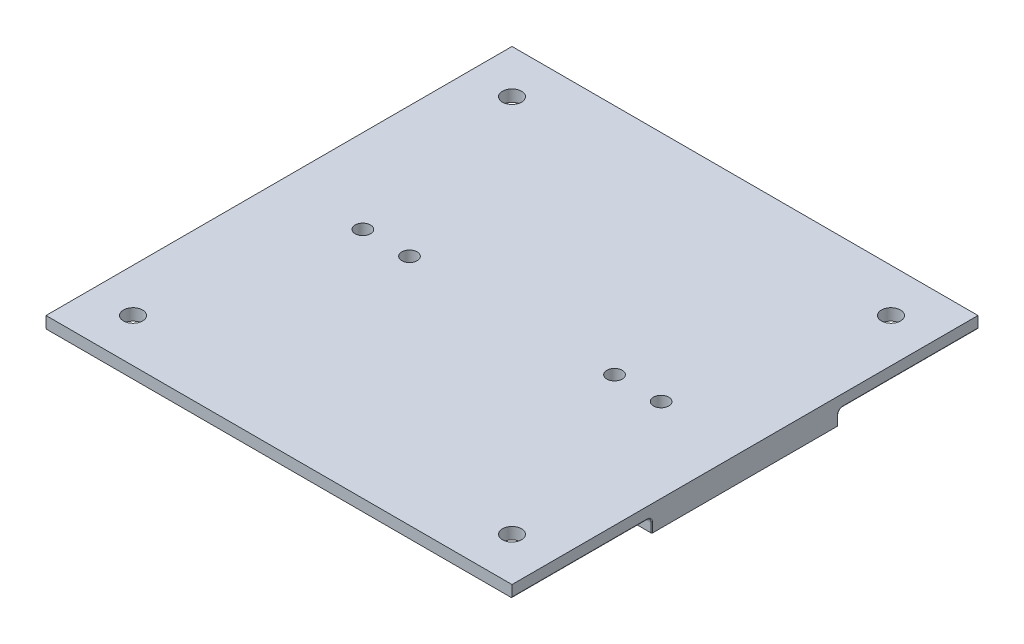
ISO-10303-21;
HEADER;
FILE_DESCRIPTION(('STEP AP214'),'2;1');
FILE_NAME('part.step','',(''),(''),'','','');
FILE_SCHEMA(('AUTOMOTIVE_DESIGN { 1 0 10303 214 1 1 1 1 }'));
ENDSEC;
DATA;
#1=APPLICATION_CONTEXT('core data for automotive mechanical design processes');
#2=APPLICATION_PROTOCOL_DEFINITION('international standard','automotive_design',2000,#1);
#3=PRODUCT_CONTEXT('',#1,'mechanical');
#4=PRODUCT('Part','Part','',(#3));
#5=PRODUCT_RELATED_PRODUCT_CATEGORY('part','',(#4));
#6=PRODUCT_DEFINITION_FORMATION('','',#4);
#7=PRODUCT_DEFINITION_CONTEXT('part definition',#1,'design');
#8=PRODUCT_DEFINITION('design','',#6,#7);
#9=PRODUCT_DEFINITION_SHAPE('','',#8);
#10=(LENGTH_UNIT() NAMED_UNIT(*) SI_UNIT(.MILLI.,.METRE.));
#11=(NAMED_UNIT(*) PLANE_ANGLE_UNIT() SI_UNIT($,.RADIAN.));
#12=(NAMED_UNIT(*) SI_UNIT($,.STERADIAN.) SOLID_ANGLE_UNIT());
#13=UNCERTAINTY_MEASURE_WITH_UNIT(LENGTH_MEASURE(1.E-05),#10,'distance_accuracy_value','');
#14=(GEOMETRIC_REPRESENTATION_CONTEXT(3) GLOBAL_UNCERTAINTY_ASSIGNED_CONTEXT((#13)) GLOBAL_UNIT_ASSIGNED_CONTEXT((#10,
#11,#12)) REPRESENTATION_CONTEXT('',''));
#15=CARTESIAN_POINT('',(0.,0.,0.));
#16=DIRECTION('',(0.,0.,1.));
#17=DIRECTION('',(1.,0.,0.));
#18=AXIS2_PLACEMENT_3D('',#15,#16,#17);
#19=CARTESIAN_POINT('',(0.,0.,0.));
#20=DIRECTION('',(0.,1.,0.));
#21=DIRECTION('',(0.,0.,1.));
#22=AXIS2_PLACEMENT_3D('',#19,#20,#21);
#23=PLANE('',#22);
#24=CARTESIAN_POINT('',(40.66,0.,-40.6599999999999));
#25=DIRECTION('',(0.,1.,0.));
#26=DIRECTION('',(0.,0.,1.));
#27=AXIS2_PLACEMENT_3D('',#24,#25,#26);
#28=CIRCLE('',#27,2.05);
#29=CARTESIAN_POINT('',(40.66,0.,-38.6099999999999));
#30=VERTEX_POINT('',#29);
#31=EDGE_CURVE('E347',#30,#30,#28,.T.);
#32=ORIENTED_EDGE('',*,*,#31,.T.);
#33=EDGE_LOOP('',(#32));
#34=FACE_BOUND('',#33,.T.);
#35=CARTESIAN_POINT('',(-40.6599999999999,0.,-40.6599999999999));
#36=DIRECTION('',(0.,1.,0.));
#37=DIRECTION('',(0.,0.,1.));
#38=AXIS2_PLACEMENT_3D('',#35,#36,#37);
#39=CIRCLE('',#38,2.05);
#40=CARTESIAN_POINT('',(-40.6599999999999,0.,-38.6099999999999));
#41=VERTEX_POINT('',#40);
#42=EDGE_CURVE('E353',#41,#41,#39,.T.);
#43=ORIENTED_EDGE('',*,*,#42,.T.);
#44=EDGE_LOOP('',(#43));
#45=FACE_BOUND('',#44,.T.);
#46=DIRECTION('',(1.,0.,0.));
#47=VECTOR('',#46,1.);
#48=CARTESIAN_POINT('',(-50.,0.,-20.9999999999999));
#49=LINE('',#48,#47);
#50=CARTESIAN_POINT('',(49.8,0.,-20.9999999999999));
#51=VERTEX_POINT('',#50);
#52=CARTESIAN_POINT('',(-49.8,0.,-20.9999999999999));
#53=VERTEX_POINT('',#52);
#54=EDGE_CURVE('E202',#51,#53,#49,.F.);
#55=ORIENTED_EDGE('',*,*,#54,.T.);
#56=DIRECTION('',(0.,0.,1.));
#57=VECTOR('',#56,1.);
#58=CARTESIAN_POINT('',(-49.8,0.,0.));
#59=LINE('',#58,#57);
#60=CARTESIAN_POINT('',(-49.8,1.66533453693773E-13,-50.));
#61=VERTEX_POINT('',#60);
#62=EDGE_CURVE('E231',#53,#61,#59,.F.);
#63=ORIENTED_EDGE('',*,*,#62,.T.);
#64=DIRECTION('',(-1.,0.,0.));
#65=VECTOR('',#64,1.);
#66=CARTESIAN_POINT('',(-50.,1.66533453693773E-13,-50.));
#67=LINE('',#66,#65);
#68=CARTESIAN_POINT('',(49.8,1.11022302462516E-13,-50.));
#69=VERTEX_POINT('',#68);
#70=EDGE_CURVE('E359',#69,#61,#67,.T.);
#71=ORIENTED_EDGE('',*,*,#70,.F.);
#72=DIRECTION('',(0.,0.,-1.));
#73=VECTOR('',#72,1.);
#74=CARTESIAN_POINT('',(49.8,0.,0.));
#75=LINE('',#74,#73);
#76=EDGE_CURVE('E229',#69,#51,#75,.F.);
#77=ORIENTED_EDGE('',*,*,#76,.T.);
#78=EDGE_LOOP('',(#55,#63,#71,#77));
#79=FACE_BOUND('',#78,.T.);
#80=ADVANCED_FACE('F45',(#34,#45,#79),#23,.F.);
#81=CARTESIAN_POINT('',(-40.66,1.11022302462516E-13,40.6599999999999));
#82=DIRECTION('',(0.,1.,0.));
#83=DIRECTION('',(0.,0.,1.));
#84=AXIS2_PLACEMENT_3D('',#81,#82,#83);
#85=CIRCLE('',#84,2.05);
#86=CARTESIAN_POINT('',(-40.66,1.11022302462516E-13,42.7099999999999));
#87=VERTEX_POINT('',#86);
#88=EDGE_CURVE('E337',#87,#87,#85,.T.);
#89=ORIENTED_EDGE('',*,*,#88,.T.);
#90=EDGE_LOOP('',(#89));
#91=FACE_BOUND('',#90,.T.);
#92=CARTESIAN_POINT('',(40.6600000000001,1.66533453693773E-13,40.6599999999999));
#93=DIRECTION('',(0.,1.,0.));
#94=DIRECTION('',(0.,0.,1.));
#95=AXIS2_PLACEMENT_3D('',#92,#93,#94);
#96=CIRCLE('',#95,2.04999999999999);
#97=CARTESIAN_POINT('',(40.6600000000001,1.66533453693773E-13,42.7099999999999));
#98=VERTEX_POINT('',#97);
#99=EDGE_CURVE('E341',#98,#98,#96,.T.);
#100=ORIENTED_EDGE('',*,*,#99,.T.);
#101=EDGE_LOOP('',(#100));
#102=FACE_BOUND('',#101,.T.);
#103=DIRECTION('',(1.,0.,0.));
#104=VECTOR('',#103,1.);
#105=CARTESIAN_POINT('',(-49.9999999999999,0.,50.0000000000003));
#106=LINE('',#105,#104);
#107=CARTESIAN_POINT('',(-49.8,0.,50.0000000000003));
#108=VERTEX_POINT('',#107);
#109=CARTESIAN_POINT('',(49.8,0.,50.0000000000003));
#110=VERTEX_POINT('',#109);
#111=EDGE_CURVE('E193',#108,#110,#106,.T.);
#112=ORIENTED_EDGE('',*,*,#111,.F.);
#113=DIRECTION('',(0.,0.,1.));
#114=VECTOR('',#113,1.);
#115=CARTESIAN_POINT('',(-49.8,0.,0.));
#116=LINE('',#115,#114);
#117=CARTESIAN_POINT('',(-49.7999999999997,1.66533453693773E-13,20.9999999999999));
#118=VERTEX_POINT('',#117);
#119=EDGE_CURVE('E247',#108,#118,#116,.F.);
#120=ORIENTED_EDGE('',*,*,#119,.T.);
#121=DIRECTION('',(-1.,0.,0.));
#122=VECTOR('',#121,1.);
#123=CARTESIAN_POINT('',(50.0000000000003,1.11022302462516E-13,20.9999999999999));
#124=LINE('',#123,#122);
#125=CARTESIAN_POINT('',(49.8000000000002,1.11022302462516E-13,20.9999999999999));
#126=VERTEX_POINT('',#125);
#127=EDGE_CURVE('E212',#118,#126,#124,.F.);
#128=ORIENTED_EDGE('',*,*,#127,.T.);
#129=DIRECTION('',(0.,0.,-1.));
#130=VECTOR('',#129,1.);
#131=CARTESIAN_POINT('',(49.8,0.,0.));
#132=LINE('',#131,#130);
#133=EDGE_CURVE('E245',#126,#110,#132,.F.);
#134=ORIENTED_EDGE('',*,*,#133,.T.);
#135=EDGE_LOOP('',(#112,#120,#128,#134));
#136=FACE_BOUND('',#135,.T.);
#137=ADVANCED_FACE('F383',(#91,#102,#136),#23,.F.);
#138=CARTESIAN_POINT('',(-2.22044604925031E-13,2.49999999999995,0.));
#139=DIRECTION('',(0.,1.,0.));
#140=DIRECTION('',(0.,0.,1.));
#141=AXIS2_PLACEMENT_3D('',#138,#139,#140);
#142=PLANE('',#141);
#143=CARTESIAN_POINT('',(31.9999999999998,2.49999999999995,0.));
#144=DIRECTION('',(0.,-1.,0.));
#145=DIRECTION('',(0.,0.,-1.));
#146=AXIS2_PLACEMENT_3D('',#143,#144,#145);
#147=CIRCLE('',#146,1.65);
#148=CARTESIAN_POINT('',(31.9999999999998,2.49999999999995,-1.65));
#149=VERTEX_POINT('',#148);
#150=EDGE_CURVE('E295',#149,#149,#147,.T.);
#151=ORIENTED_EDGE('',*,*,#150,.T.);
#152=EDGE_LOOP('',(#151));
#153=FACE_BOUND('',#152,.T.);
#154=CARTESIAN_POINT('',(21.9999999999998,2.49999999999995,0.));
#155=DIRECTION('',(0.,-1.,0.));
#156=DIRECTION('',(0.,0.,-1.));
#157=AXIS2_PLACEMENT_3D('',#154,#155,#156);
#158=CIRCLE('',#157,1.65);
#159=CARTESIAN_POINT('',(21.9999999999998,2.49999999999995,-1.64999999999997));
#160=VERTEX_POINT('',#159);
#161=EDGE_CURVE('E313',#160,#160,#158,.T.);
#162=ORIENTED_EDGE('',*,*,#161,.T.);
#163=EDGE_LOOP('',(#162));
#164=FACE_BOUND('',#163,.T.);
#165=CARTESIAN_POINT('',(-22.0000000000002,2.5,0.));
#166=DIRECTION('',(0.,-1.,0.));
#167=DIRECTION('',(0.,0.,-1.));
#168=AXIS2_PLACEMENT_3D('',#165,#166,#167);
#169=CIRCLE('',#168,1.65);
#170=CARTESIAN_POINT('',(-22.0000000000002,2.5,-1.65));
#171=VERTEX_POINT('',#170);
#172=EDGE_CURVE('E319',#171,#171,#169,.T.);
#173=ORIENTED_EDGE('',*,*,#172,.T.);
#174=EDGE_LOOP('',(#173));
#175=FACE_BOUND('',#174,.T.);
#176=CARTESIAN_POINT('',(-32.0000000000002,2.49999999999995,0.));
#177=DIRECTION('',(0.,-1.,0.));
#178=DIRECTION('',(0.,0.,-1.));
#179=AXIS2_PLACEMENT_3D('',#176,#177,#178);
#180=CIRCLE('',#179,1.65);
#181=CARTESIAN_POINT('',(-32.0000000000002,2.49999999999995,-1.65));
#182=VERTEX_POINT('',#181);
#183=EDGE_CURVE('E325',#182,#182,#180,.T.);
#184=ORIENTED_EDGE('',*,*,#183,.T.);
#185=EDGE_LOOP('',(#184));
#186=FACE_BOUND('',#185,.T.);
#187=CARTESIAN_POINT('',(40.6600000000002,2.50000000000011,40.6599999999999));
#188=DIRECTION('',(0.,1.,0.));
#189=DIRECTION('',(0.,0.,1.));
#190=AXIS2_PLACEMENT_3D('',#187,#188,#189);
#191=CIRCLE('',#190,2.04999999999999);
#192=CARTESIAN_POINT('',(40.6600000000002,2.50000000000011,42.7099999999999));
#193=VERTEX_POINT('',#192);
#194=EDGE_CURVE('E344',#193,#193,#191,.T.);
#195=ORIENTED_EDGE('',*,*,#194,.F.);
#196=EDGE_LOOP('',(#195));
#197=FACE_BOUND('',#196,.T.);
#198=CARTESIAN_POINT('',(-40.6599999999998,2.49999999999995,-40.6599999999999));
#199=DIRECTION('',(0.,1.,0.));
#200=DIRECTION('',(0.,0.,1.));
#201=AXIS2_PLACEMENT_3D('',#198,#199,#200);
#202=CIRCLE('',#201,2.05);
#203=CARTESIAN_POINT('',(-40.6599999999998,2.49999999999995,-38.6099999999999));
#204=VERTEX_POINT('',#203);
#205=EDGE_CURVE('E356',#204,#204,#202,.T.);
#206=ORIENTED_EDGE('',*,*,#205,.F.);
#207=EDGE_LOOP('',(#206));
#208=FACE_BOUND('',#207,.T.);
#209=DIRECTION('',(0.,0.,-1.));
#210=VECTOR('',#209,1.);
#211=CARTESIAN_POINT('',(49.9999999999998,2.50000000000006,-50.));
#212=LINE('',#211,#210);
#213=CARTESIAN_POINT('',(49.9999999999998,2.49999999999995,50.0000000000003));
#214=VERTEX_POINT('',#213);
#215=CARTESIAN_POINT('',(49.9999999999998,2.50000000000006,-50.));
#216=VERTEX_POINT('',#215);
#217=EDGE_CURVE('E183',#214,#216,#212,.T.);
#218=ORIENTED_EDGE('',*,*,#217,.T.);
#219=DIRECTION('',(-1.,0.,0.));
#220=VECTOR('',#219,1.);
#221=CARTESIAN_POINT('',(-50.0000000000003,2.50000000000011,-50.));
#222=LINE('',#221,#220);
#223=CARTESIAN_POINT('',(-50.0000000000003,2.50000000000011,-50.));
#224=VERTEX_POINT('',#223);
#225=EDGE_CURVE('E172',#216,#224,#222,.T.);
#226=ORIENTED_EDGE('',*,*,#225,.T.);
#227=DIRECTION('',(0.,0.,1.));
#228=VECTOR('',#227,1.);
#229=CARTESIAN_POINT('',(-50.0000000000003,2.50000000000011,-50.));
#230=LINE('',#229,#228);
#231=CARTESIAN_POINT('',(-50.0000000000002,2.5,50.0000000000003));
#232=VERTEX_POINT('',#231);
#233=EDGE_CURVE('E182',#224,#232,#230,.T.);
#234=ORIENTED_EDGE('',*,*,#233,.T.);
#235=DIRECTION('',(1.,0.,0.));
#236=VECTOR('',#235,1.);
#237=CARTESIAN_POINT('',(-50.0000000000002,2.5,50.0000000000003));
#238=LINE('',#237,#236);
#239=EDGE_CURVE('E189',#232,#214,#238,.T.);
#240=ORIENTED_EDGE('',*,*,#239,.T.);
#241=EDGE_LOOP('',(#218,#226,#234,#240));
#242=FACE_BOUND('',#241,.T.);
#243=CARTESIAN_POINT('',(40.6600000000002,2.5,-40.6599999999999));
#244=DIRECTION('',(0.,1.,0.));
#245=DIRECTION('',(0.,0.,1.));
#246=AXIS2_PLACEMENT_3D('',#243,#244,#245);
#247=CIRCLE('',#246,2.05);
#248=CARTESIAN_POINT('',(40.6600000000002,2.5,-38.6099999999999));
#249=VERTEX_POINT('',#248);
#250=EDGE_CURVE('E350',#249,#249,#247,.T.);
#251=ORIENTED_EDGE('',*,*,#250,.F.);
#252=EDGE_LOOP('',(#251));
#253=FACE_BOUND('',#252,.T.);
#254=CARTESIAN_POINT('',(-40.6599999999998,2.50000000000006,40.6599999999999));
#255=DIRECTION('',(0.,1.,0.));
#256=DIRECTION('',(0.,0.,1.));
#257=AXIS2_PLACEMENT_3D('',#254,#255,#256);
#258=CIRCLE('',#257,2.05);
#259=CARTESIAN_POINT('',(-40.6599999999998,2.50000000000006,42.7099999999999));
#260=VERTEX_POINT('',#259);
#261=EDGE_CURVE('E338',#260,#260,#258,.T.);
#262=ORIENTED_EDGE('',*,*,#261,.F.);
#263=EDGE_LOOP('',(#262));
#264=FACE_BOUND('',#263,.T.);
#265=ADVANCED_FACE('F186',(#153,#164,#175,#186,#197,#208,#242,#253,#264),#142,.T.);
#266=CARTESIAN_POINT('',(49.9999999999998,2.50000000000006,-50.));
#267=DIRECTION('',(-1.,0.,0.));
#268=DIRECTION('',(0.,0.,1.));
#269=AXIS2_PLACEMENT_3D('',#266,#267,#268);
#270=PLANE('',#269);
#271=CARTESIAN_POINT('',(50.,-1.,-20.9999999999999));
#272=DIRECTION('',(-1.,0.,0.));
#273=DIRECTION('',(0.,0.,1.));
#274=AXIS2_PLACEMENT_3D('',#271,#272,#273);
#275=CIRCLE('',#274,1.2);
#276=CARTESIAN_POINT('',(50.,-1.,-19.8));
#277=VERTEX_POINT('',#276);
#278=CARTESIAN_POINT('',(50.,0.199999999999978,-20.9999999999999));
#279=VERTEX_POINT('',#278);
#280=EDGE_CURVE('E262',#277,#279,#275,.T.);
#281=ORIENTED_EDGE('',*,*,#280,.T.);
#282=DIRECTION('',(0.,0.,-1.));
#283=VECTOR('',#282,1.);
#284=CARTESIAN_POINT('',(50.,0.200000000000089,-50.));
#285=LINE('',#284,#283);
#286=CARTESIAN_POINT('',(50.,0.200000000000089,-50.));
#287=VERTEX_POINT('',#286);
#288=EDGE_CURVE('E198',#279,#287,#285,.T.);
#289=ORIENTED_EDGE('',*,*,#288,.T.);
#290=DIRECTION('',(0.,-1.,0.));
#291=VECTOR('',#290,1.);
#292=CARTESIAN_POINT('',(49.9999999999998,2.50000000000006,-50.));
#293=LINE('',#292,#291);
#294=EDGE_CURVE('E177',#216,#287,#293,.T.);
#295=ORIENTED_EDGE('',*,*,#294,.F.);
#296=ORIENTED_EDGE('',*,*,#217,.F.);
#297=DIRECTION('',(0.,-1.,0.));
#298=VECTOR('',#297,1.);
#299=CARTESIAN_POINT('',(49.9999999999998,2.49999999999995,50.0000000000003));
#300=LINE('',#299,#298);
#301=CARTESIAN_POINT('',(50.,0.199999999999978,50.0000000000003));
#302=VERTEX_POINT('',#301);
#303=EDGE_CURVE('E364',#214,#302,#300,.T.);
#304=ORIENTED_EDGE('',*,*,#303,.T.);
#305=DIRECTION('',(0.,0.,-1.));
#306=VECTOR('',#305,1.);
#307=CARTESIAN_POINT('',(50.,0.200000000000089,-50.));
#308=LINE('',#307,#306);
#309=CARTESIAN_POINT('',(50.0000000000003,0.200000000000089,20.9999999999999));
#310=VERTEX_POINT('',#309);
#311=EDGE_CURVE('E257',#302,#310,#308,.T.);
#312=ORIENTED_EDGE('',*,*,#311,.T.);
#313=CARTESIAN_POINT('',(50.,-0.99999999999989,20.9999999999999));
#314=DIRECTION('',(-1.,0.,0.));
#315=DIRECTION('',(0.,0.,1.));
#316=AXIS2_PLACEMENT_3D('',#313,#314,#315);
#317=CIRCLE('',#316,1.2);
#318=CARTESIAN_POINT('',(50.0000000000003,-1.,19.8));
#319=VERTEX_POINT('',#318);
#320=EDGE_CURVE('E255',#310,#319,#317,.T.);
#321=ORIENTED_EDGE('',*,*,#320,.T.);
#322=DIRECTION('',(0.,1.,0.));
#323=VECTOR('',#322,1.);
#324=CARTESIAN_POINT('',(50.,2.49999999999995,19.8));
#325=LINE('',#324,#323);
#326=CARTESIAN_POINT('',(49.9999999999998,-3.,19.8));
#327=VERTEX_POINT('',#326);
#328=EDGE_CURVE('E253',#319,#327,#325,.F.);
#329=ORIENTED_EDGE('',*,*,#328,.T.);
#330=DIRECTION('',(0.,0.,1.));
#331=VECTOR('',#330,1.);
#332=CARTESIAN_POINT('',(49.9999999999998,-3.,20.));
#333=LINE('',#332,#331);
#334=CARTESIAN_POINT('',(49.9999999999999,-3.,-19.8));
#335=VERTEX_POINT('',#334);
#336=EDGE_CURVE('E283',#335,#327,#333,.T.);
#337=ORIENTED_EDGE('',*,*,#336,.F.);
#338=DIRECTION('',(0.,1.,0.));
#339=VECTOR('',#338,1.);
#340=CARTESIAN_POINT('',(49.9999999999998,2.49999999999995,-19.8));
#341=LINE('',#340,#339);
#342=EDGE_CURVE('E260',#335,#277,#341,.T.);
#343=ORIENTED_EDGE('',*,*,#342,.T.);
#344=EDGE_LOOP('',(#281,#289,#295,#296,#304,#312,#321,#329,#337,#343));
#345=FACE_BOUND('',#344,.T.);
#346=ADVANCED_FACE('F196',(#345),#270,.F.);
#347=CARTESIAN_POINT('',(-50.0000000000003,2.50000000000011,-50.));
#348=DIRECTION('',(0.,0.,1.));
#349=DIRECTION('',(1.,0.,0.));
#350=AXIS2_PLACEMENT_3D('',#347,#348,#349);
#351=PLANE('',#350);
#352=ORIENTED_EDGE('',*,*,#70,.T.);
#353=CARTESIAN_POINT('',(-49.8,0.200000000000145,-50.));
#354=DIRECTION('',(0.,0.,1.));
#355=DIRECTION('',(1.,0.,0.));
#356=AXIS2_PLACEMENT_3D('',#353,#354,#355);
#357=CIRCLE('',#356,0.2);
#358=CARTESIAN_POINT('',(-50.,0.200000000000145,-50.));
#359=VERTEX_POINT('',#358);
#360=EDGE_CURVE('E235',#61,#359,#357,.F.);
#361=ORIENTED_EDGE('',*,*,#360,.T.);
#362=DIRECTION('',(0.,-1.,0.));
#363=VECTOR('',#362,1.);
#364=CARTESIAN_POINT('',(-50.0000000000003,2.50000000000011,-50.));
#365=LINE('',#364,#363);
#366=EDGE_CURVE('E179',#224,#359,#365,.T.);
#367=ORIENTED_EDGE('',*,*,#366,.F.);
#368=ORIENTED_EDGE('',*,*,#225,.F.);
#369=ORIENTED_EDGE('',*,*,#294,.T.);
#370=CARTESIAN_POINT('',(49.8,0.200000000000089,-50.));
#371=DIRECTION('',(0.,0.,1.));
#372=DIRECTION('',(1.,0.,0.));
#373=AXIS2_PLACEMENT_3D('',#370,#371,#372);
#374=CIRCLE('',#373,0.2);
#375=EDGE_CURVE('E233',#287,#69,#374,.F.);
#376=ORIENTED_EDGE('',*,*,#375,.T.);
#377=EDGE_LOOP('',(#352,#361,#367,#368,#369,#376));
#378=FACE_BOUND('',#377,.T.);
#379=ADVANCED_FACE('F175',(#378),#351,.F.);
#380=CARTESIAN_POINT('',(-50.0000000000003,2.50000000000011,-50.));
#381=DIRECTION('',(1.,0.,0.));
#382=DIRECTION('',(0.,0.,-1.));
#383=AXIS2_PLACEMENT_3D('',#380,#381,#382);
#384=PLANE('',#383);
#385=ORIENTED_EDGE('',*,*,#366,.T.);
#386=DIRECTION('',(0.,0.,1.));
#387=VECTOR('',#386,1.);
#388=CARTESIAN_POINT('',(-50.,0.200000000000145,-50.));
#389=LINE('',#388,#387);
#390=CARTESIAN_POINT('',(-50.,0.200000000000033,-20.9999999999999));
#391=VERTEX_POINT('',#390);
#392=EDGE_CURVE('E226',#359,#391,#389,.T.);
#393=ORIENTED_EDGE('',*,*,#392,.T.);
#394=CARTESIAN_POINT('',(-50.,-0.999999999999945,-20.9999999999999));
#395=DIRECTION('',(1.,0.,0.));
#396=DIRECTION('',(0.,0.,-1.));
#397=AXIS2_PLACEMENT_3D('',#394,#395,#396);
#398=CIRCLE('',#397,1.2);
#399=CARTESIAN_POINT('',(-50.,-0.999999999999945,-19.8));
#400=VERTEX_POINT('',#399);
#401=EDGE_CURVE('E224',#391,#400,#398,.T.);
#402=ORIENTED_EDGE('',*,*,#401,.T.);
#403=DIRECTION('',(0.,1.,0.));
#404=VECTOR('',#403,1.);
#405=CARTESIAN_POINT('',(-50.0000000000003,2.5,-19.8));
#406=LINE('',#405,#404);
#407=CARTESIAN_POINT('',(-50.,-2.99999999999995,-19.8));
#408=VERTEX_POINT('',#407);
#409=EDGE_CURVE('E222',#400,#408,#406,.F.);
#410=ORIENTED_EDGE('',*,*,#409,.T.);
#411=DIRECTION('',(0.,0.,-1.));
#412=VECTOR('',#411,1.);
#413=CARTESIAN_POINT('',(-50.,-2.99999999999995,20.));
#414=LINE('',#413,#412);
#415=CARTESIAN_POINT('',(-50.,-2.99999999999995,19.8000000000001));
#416=VERTEX_POINT('',#415);
#417=EDGE_CURVE('E331',#416,#408,#414,.T.);
#418=ORIENTED_EDGE('',*,*,#417,.F.);
#419=DIRECTION('',(0.,1.,0.));
#420=VECTOR('',#419,1.);
#421=CARTESIAN_POINT('',(-50.,2.5,19.8000000000001));
#422=LINE('',#421,#420);
#423=CARTESIAN_POINT('',(-49.9999999999998,-0.999999999999945,19.8000000000001));
#424=VERTEX_POINT('',#423);
#425=EDGE_CURVE('E215',#416,#424,#422,.T.);
#426=ORIENTED_EDGE('',*,*,#425,.T.);
#427=CARTESIAN_POINT('',(-50.,-0.999999999999834,20.9999999999999));
#428=DIRECTION('',(1.,0.,0.));
#429=DIRECTION('',(0.,0.,-1.));
#430=AXIS2_PLACEMENT_3D('',#427,#428,#429);
#431=CIRCLE('',#430,1.2);
#432=CARTESIAN_POINT('',(-49.9999999999998,0.200000000000145,20.9999999999999));
#433=VERTEX_POINT('',#432);
#434=EDGE_CURVE('E217',#424,#433,#431,.T.);
#435=ORIENTED_EDGE('',*,*,#434,.T.);
#436=DIRECTION('',(0.,0.,1.));
#437=VECTOR('',#436,1.);
#438=CARTESIAN_POINT('',(-50.,0.200000000000145,-50.));
#439=LINE('',#438,#437);
#440=CARTESIAN_POINT('',(-49.9999999999999,0.200000000000033,50.0000000000003));
#441=VERTEX_POINT('',#440);
#442=EDGE_CURVE('E219',#433,#441,#439,.T.);
#443=ORIENTED_EDGE('',*,*,#442,.T.);
#444=DIRECTION('',(0.,-1.,0.));
#445=VECTOR('',#444,1.);
#446=CARTESIAN_POINT('',(-50.0000000000002,2.5,50.0000000000003));
#447=LINE('',#446,#445);
#448=EDGE_CURVE('E204',#232,#441,#447,.T.);
#449=ORIENTED_EDGE('',*,*,#448,.F.);
#450=ORIENTED_EDGE('',*,*,#233,.F.);
#451=EDGE_LOOP('',(#385,#393,#402,#410,#418,#426,#435,#443,#449,#450));
#452=FACE_BOUND('',#451,.T.);
#453=ADVANCED_FACE('F374',(#452),#384,.F.);
#454=CARTESIAN_POINT('',(-50.0000000000002,2.5,50.0000000000003));
#455=DIRECTION('',(0.,0.,-1.));
#456=DIRECTION('',(-1.,0.,0.));
#457=AXIS2_PLACEMENT_3D('',#454,#455,#456);
#458=PLANE('',#457);
#459=ORIENTED_EDGE('',*,*,#448,.T.);
#460=CARTESIAN_POINT('',(-49.8,0.200000000000033,50.0000000000003));
#461=DIRECTION('',(0.,0.,-1.));
#462=DIRECTION('',(-1.,0.,0.));
#463=AXIS2_PLACEMENT_3D('',#460,#461,#462);
#464=CIRCLE('',#463,0.2);
#465=EDGE_CURVE('E243',#441,#108,#464,.F.);
#466=ORIENTED_EDGE('',*,*,#465,.T.);
#467=ORIENTED_EDGE('',*,*,#111,.T.);
#468=CARTESIAN_POINT('',(49.8,0.199999999999978,50.0000000000003));
#469=DIRECTION('',(0.,0.,-1.));
#470=DIRECTION('',(-1.,0.,0.));
#471=AXIS2_PLACEMENT_3D('',#468,#469,#470);
#472=CIRCLE('',#471,0.2);
#473=EDGE_CURVE('E241',#110,#302,#472,.F.);
#474=ORIENTED_EDGE('',*,*,#473,.T.);
#475=ORIENTED_EDGE('',*,*,#303,.F.);
#476=ORIENTED_EDGE('',*,*,#239,.F.);
#477=EDGE_LOOP('',(#459,#466,#467,#474,#475,#476));
#478=FACE_BOUND('',#477,.T.);
#479=ADVANCED_FACE('F371',(#478),#458,.F.);
#480=CARTESIAN_POINT('',(-40.6599999999998,2.49999999999995,-40.6599999999999));
#481=DIRECTION('',(0.,-1.,0.));
#482=DIRECTION('',(0.,0.,-1.));
#483=AXIS2_PLACEMENT_3D('',#480,#481,#482);
#484=CYLINDRICAL_SURFACE('',#483,2.05);
#485=ORIENTED_EDGE('',*,*,#205,.T.);
#486=EDGE_LOOP('',(#485));
#487=FACE_BOUND('',#486,.T.);
#488=ORIENTED_EDGE('',*,*,#42,.F.);
#489=EDGE_LOOP('',(#488));
#490=FACE_BOUND('',#489,.T.);
#491=ADVANCED_FACE('F472',(#487,#490),#484,.F.);
#492=CARTESIAN_POINT('',(40.6600000000002,2.5,-40.6599999999999));
#493=DIRECTION('',(0.,-1.,0.));
#494=DIRECTION('',(0.,0.,-1.));
#495=AXIS2_PLACEMENT_3D('',#492,#493,#494);
#496=CYLINDRICAL_SURFACE('',#495,2.05);
#497=ORIENTED_EDGE('',*,*,#250,.T.);
#498=EDGE_LOOP('',(#497));
#499=FACE_BOUND('',#498,.T.);
#500=ORIENTED_EDGE('',*,*,#31,.F.);
#501=EDGE_LOOP('',(#500));
#502=FACE_BOUND('',#501,.T.);
#503=ADVANCED_FACE('F568',(#499,#502),#496,.F.);
#504=CARTESIAN_POINT('',(40.6600000000002,2.50000000000011,40.6599999999999));
#505=DIRECTION('',(0.,-1.,0.));
#506=DIRECTION('',(0.,0.,-1.));
#507=AXIS2_PLACEMENT_3D('',#504,#505,#506);
#508=CYLINDRICAL_SURFACE('',#507,2.04999999999999);
#509=ORIENTED_EDGE('',*,*,#194,.T.);
#510=EDGE_LOOP('',(#509));
#511=FACE_BOUND('',#510,.T.);
#512=ORIENTED_EDGE('',*,*,#99,.F.);
#513=EDGE_LOOP('',(#512));
#514=FACE_BOUND('',#513,.T.);
#515=ADVANCED_FACE('F564',(#511,#514),#508,.F.);
#516=CARTESIAN_POINT('',(-40.6599999999998,2.50000000000006,40.6599999999999));
#517=DIRECTION('',(0.,-1.,0.));
#518=DIRECTION('',(0.,0.,-1.));
#519=AXIS2_PLACEMENT_3D('',#516,#517,#518);
#520=CYLINDRICAL_SURFACE('',#519,2.05);
#521=ORIENTED_EDGE('',*,*,#261,.T.);
#522=EDGE_LOOP('',(#521));
#523=FACE_BOUND('',#522,.T.);
#524=ORIENTED_EDGE('',*,*,#88,.F.);
#525=EDGE_LOOP('',(#524));
#526=FACE_BOUND('',#525,.T.);
#527=ADVANCED_FACE('F561',(#523,#526),#520,.F.);
#528=CARTESIAN_POINT('',(-50.,-2.99999999999995,20.));
#529=DIRECTION('',(0.,0.,-1.));
#530=DIRECTION('',(-1.,0.,0.));
#531=AXIS2_PLACEMENT_3D('',#528,#529,#530);
#532=PLANE('',#531);
#533=DIRECTION('',(-1.,0.,0.));
#534=VECTOR('',#533,1.);
#535=CARTESIAN_POINT('',(-49.9999999999998,-0.999999999999945,20.));
#536=LINE('',#535,#534);
#537=CARTESIAN_POINT('',(49.8000000000002,-1.,20.));
#538=VERTEX_POINT('',#537);
#539=CARTESIAN_POINT('',(-49.7999999999997,-0.999999999999945,20.));
#540=VERTEX_POINT('',#539);
#541=EDGE_CURVE('E210',#538,#540,#536,.T.);
#542=ORIENTED_EDGE('',*,*,#541,.T.);
#543=DIRECTION('',(0.,1.,0.));
#544=VECTOR('',#543,1.);
#545=CARTESIAN_POINT('',(-49.8,-2.99999999999995,20.));
#546=LINE('',#545,#544);
#547=CARTESIAN_POINT('',(-49.8,-2.99999999999995,20.));
#548=VERTEX_POINT('',#547);
#549=EDGE_CURVE('E11',#540,#548,#546,.F.);
#550=ORIENTED_EDGE('',*,*,#549,.T.);
#551=DIRECTION('',(-1.,0.,0.));
#552=VECTOR('',#551,1.);
#553=CARTESIAN_POINT('',(-50.,-2.99999999999995,20.));
#554=LINE('',#553,#552);
#555=CARTESIAN_POINT('',(49.8,-3.,20.));
#556=VERTEX_POINT('',#555);
#557=EDGE_CURVE('E329',#556,#548,#554,.T.);
#558=ORIENTED_EDGE('',*,*,#557,.F.);
#559=DIRECTION('',(0.,1.,0.));
#560=VECTOR('',#559,1.);
#561=CARTESIAN_POINT('',(49.8,-3.,20.));
#562=LINE('',#561,#560);
#563=EDGE_CURVE('E54',#556,#538,#562,.T.);
#564=ORIENTED_EDGE('',*,*,#563,.T.);
#565=EDGE_LOOP('',(#542,#550,#558,#564));
#566=FACE_BOUND('',#565,.T.);
#567=ADVANCED_FACE('F558',(#566),#532,.F.);
#568=CARTESIAN_POINT('',(-50.,-2.99999999999995,-20.));
#569=DIRECTION('',(0.,0.,1.));
#570=DIRECTION('',(1.,0.,0.));
#571=AXIS2_PLACEMENT_3D('',#568,#569,#570);
#572=PLANE('',#571);
#573=DIRECTION('',(1.,0.,0.));
#574=VECTOR('',#573,1.);
#575=CARTESIAN_POINT('',(-50.,-2.99999999999995,-20.));
#576=LINE('',#575,#574);
#577=CARTESIAN_POINT('',(-49.8,-2.99999999999995,-20.));
#578=VERTEX_POINT('',#577);
#579=CARTESIAN_POINT('',(49.8,-3.,-20.));
#580=VERTEX_POINT('',#579);
#581=EDGE_CURVE('E334',#578,#580,#576,.T.);
#582=ORIENTED_EDGE('',*,*,#581,.F.);
#583=DIRECTION('',(0.,1.,0.));
#584=VECTOR('',#583,1.);
#585=CARTESIAN_POINT('',(-49.8,-2.99999999999995,-20.));
#586=LINE('',#585,#584);
#587=CARTESIAN_POINT('',(-49.8,-0.999999999999945,-20.));
#588=VERTEX_POINT('',#587);
#589=EDGE_CURVE('E267',#578,#588,#586,.T.);
#590=ORIENTED_EDGE('',*,*,#589,.T.);
#591=DIRECTION('',(1.,0.,0.));
#592=VECTOR('',#591,1.);
#593=CARTESIAN_POINT('',(50.,-1.,-20.));
#594=LINE('',#593,#592);
#595=CARTESIAN_POINT('',(49.8,-1.,-20.));
#596=VERTEX_POINT('',#595);
#597=EDGE_CURVE('E199',#588,#596,#594,.T.);
#598=ORIENTED_EDGE('',*,*,#597,.T.);
#599=DIRECTION('',(0.,1.,0.));
#600=VECTOR('',#599,1.);
#601=CARTESIAN_POINT('',(49.8,-3.,-20.));
#602=LINE('',#601,#600);
#603=EDGE_CURVE('E265',#596,#580,#602,.F.);
#604=ORIENTED_EDGE('',*,*,#603,.T.);
#605=EDGE_LOOP('',(#582,#590,#598,#604));
#606=FACE_BOUND('',#605,.T.);
#607=ADVANCED_FACE('F432',(#606),#572,.F.);
#608=CARTESIAN_POINT('',(0.,-3.,0.));
#609=DIRECTION('',(0.,-1.,0.));
#610=DIRECTION('',(0.,0.,-1.));
#611=AXIS2_PLACEMENT_3D('',#608,#609,#610);
#612=PLANE('',#611);
#613=CARTESIAN_POINT('',(32.,-3.,0.));
#614=DIRECTION('',(0.,-1.,0.));
#615=DIRECTION('',(0.,0.,-1.));
#616=AXIS2_PLACEMENT_3D('',#613,#614,#615);
#617=CIRCLE('',#616,1.65);
#618=CARTESIAN_POINT('',(32.,-3.,-1.65));
#619=VERTEX_POINT('',#618);
#620=EDGE_CURVE('E303',#619,#619,#617,.T.);
#621=ORIENTED_EDGE('',*,*,#620,.F.);
#622=EDGE_LOOP('',(#621));
#623=FACE_BOUND('',#622,.T.);
#624=CARTESIAN_POINT('',(22.,-3.,0.));
#625=DIRECTION('',(0.,-1.,0.));
#626=DIRECTION('',(0.,0.,-1.));
#627=AXIS2_PLACEMENT_3D('',#624,#625,#626);
#628=CIRCLE('',#627,1.65);
#629=CARTESIAN_POINT('',(22.,-3.,-1.64999999999997));
#630=VERTEX_POINT('',#629);
#631=EDGE_CURVE('E308',#630,#630,#628,.T.);
#632=ORIENTED_EDGE('',*,*,#631,.F.);
#633=EDGE_LOOP('',(#632));
#634=FACE_BOUND('',#633,.T.);
#635=CARTESIAN_POINT('',(-22.,-2.99999999999995,0.));
#636=DIRECTION('',(0.,-1.,0.));
#637=DIRECTION('',(0.,0.,-1.));
#638=AXIS2_PLACEMENT_3D('',#635,#636,#637);
#639=CIRCLE('',#638,1.65);
#640=CARTESIAN_POINT('',(-22.,-2.99999999999995,-1.65));
#641=VERTEX_POINT('',#640);
#642=EDGE_CURVE('E316',#641,#641,#639,.T.);
#643=ORIENTED_EDGE('',*,*,#642,.F.);
#644=EDGE_LOOP('',(#643));
#645=FACE_BOUND('',#644,.T.);
#646=CARTESIAN_POINT('',(-32.,-3.,0.));
#647=DIRECTION('',(0.,-1.,0.));
#648=DIRECTION('',(0.,0.,-1.));
#649=AXIS2_PLACEMENT_3D('',#646,#647,#648);
#650=CIRCLE('',#649,1.65);
#651=CARTESIAN_POINT('',(-32.,-3.,-1.65));
#652=VERTEX_POINT('',#651);
#653=EDGE_CURVE('E322',#652,#652,#650,.T.);
#654=ORIENTED_EDGE('',*,*,#653,.F.);
#655=EDGE_LOOP('',(#654));
#656=FACE_BOUND('',#655,.T.);
#657=ORIENTED_EDGE('',*,*,#417,.T.);
#658=CARTESIAN_POINT('',(-49.8,-2.99999999999995,-19.8));
#659=DIRECTION('',(0.,-1.,0.));
#660=DIRECTION('',(0.,0.,-1.));
#661=AXIS2_PLACEMENT_3D('',#658,#659,#660);
#662=CIRCLE('',#661,0.2);
#663=EDGE_CURVE('E274',#408,#578,#662,.T.);
#664=ORIENTED_EDGE('',*,*,#663,.T.);
#665=ORIENTED_EDGE('',*,*,#581,.T.);
#666=CARTESIAN_POINT('',(49.8,-3.,-19.8));
#667=DIRECTION('',(0.,-1.,0.));
#668=DIRECTION('',(0.,0.,-1.));
#669=AXIS2_PLACEMENT_3D('',#666,#667,#668);
#670=CIRCLE('',#669,0.2);
#671=EDGE_CURVE('E270',#580,#335,#670,.T.);
#672=ORIENTED_EDGE('',*,*,#671,.T.);
#673=ORIENTED_EDGE('',*,*,#336,.T.);
#674=CARTESIAN_POINT('',(49.8,-3.,19.8));
#675=DIRECTION('',(0.,-1.,0.));
#676=DIRECTION('',(0.,0.,-1.));
#677=AXIS2_PLACEMENT_3D('',#674,#675,#676);
#678=CIRCLE('',#677,0.2);
#679=EDGE_CURVE('E67',#327,#556,#678,.T.);
#680=ORIENTED_EDGE('',*,*,#679,.T.);
#681=ORIENTED_EDGE('',*,*,#557,.T.);
#682=CARTESIAN_POINT('',(-49.8,-2.99999999999995,19.8000000000001));
#683=DIRECTION('',(0.,-1.,0.));
#684=DIRECTION('',(0.,0.,-1.));
#685=AXIS2_PLACEMENT_3D('',#682,#683,#684);
#686=CIRCLE('',#685,0.2);
#687=EDGE_CURVE('E272',#548,#416,#686,.T.);
#688=ORIENTED_EDGE('',*,*,#687,.T.);
#689=EDGE_LOOP('',(#657,#664,#665,#672,#673,#680,#681,#688));
#690=FACE_BOUND('',#689,.T.);
#691=ADVANCED_FACE('F397',(#623,#634,#645,#656,#690),#612,.T.);
#692=CARTESIAN_POINT('',(-50.,-0.999999999999945,-20.9999999999999));
#693=DIRECTION('',(-1.,0.,0.));
#694=DIRECTION('',(0.,0.,1.));
#695=AXIS2_PLACEMENT_3D('',#692,#693,#694);
#696=CYLINDRICAL_SURFACE('',#695,1.);
#697=ORIENTED_EDGE('',*,*,#597,.F.);
#698=CARTESIAN_POINT('',(-49.8,-0.999999999999945,-20.9999999999999));
#699=DIRECTION('',(1.,0.,0.));
#700=DIRECTION('',(0.,0.,-1.));
#701=AXIS2_PLACEMENT_3D('',#698,#699,#700);
#702=CIRCLE('',#701,1.);
#703=EDGE_CURVE('E239',#588,#53,#702,.F.);
#704=ORIENTED_EDGE('',*,*,#703,.T.);
#705=ORIENTED_EDGE('',*,*,#54,.F.);
#706=CARTESIAN_POINT('',(49.8,-1.,-20.9999999999999));
#707=DIRECTION('',(-1.,0.,0.));
#708=DIRECTION('',(0.,0.,1.));
#709=AXIS2_PLACEMENT_3D('',#706,#707,#708);
#710=CIRCLE('',#709,1.);
#711=EDGE_CURVE('E237',#51,#596,#710,.F.);
#712=ORIENTED_EDGE('',*,*,#711,.T.);
#713=EDGE_LOOP('',(#697,#704,#705,#712));
#714=FACE_BOUND('',#713,.T.);
#715=ADVANCED_FACE('F412',(#714),#696,.F.);
#716=CARTESIAN_POINT('',(-50.,-0.999999999999834,20.9999999999999));
#717=DIRECTION('',(1.,0.,0.));
#718=DIRECTION('',(0.,0.,-1.));
#719=AXIS2_PLACEMENT_3D('',#716,#717,#718);
#720=CYLINDRICAL_SURFACE('',#719,1.);
#721=ORIENTED_EDGE('',*,*,#127,.F.);
#722=CARTESIAN_POINT('',(-49.8,-0.999999999999834,20.9999999999999));
#723=DIRECTION('',(1.,0.,0.));
#724=DIRECTION('',(0.,0.,-1.));
#725=AXIS2_PLACEMENT_3D('',#722,#723,#724);
#726=CIRCLE('',#725,1.);
#727=EDGE_CURVE('E251',#118,#540,#726,.F.);
#728=ORIENTED_EDGE('',*,*,#727,.T.);
#729=ORIENTED_EDGE('',*,*,#541,.F.);
#730=CARTESIAN_POINT('',(49.8000000000001,-0.99999999999989,20.9999999999999));
#731=DIRECTION('',(-1.,0.,0.));
#732=DIRECTION('',(0.,0.,1.));
#733=AXIS2_PLACEMENT_3D('',#730,#731,#732);
#734=CIRCLE('',#733,1.);
#735=EDGE_CURVE('E249',#538,#126,#734,.F.);
#736=ORIENTED_EDGE('',*,*,#735,.T.);
#737=EDGE_LOOP('',(#721,#728,#729,#736));
#738=FACE_BOUND('',#737,.T.);
#739=ADVANCED_FACE('F386',(#738),#720,.F.);
#740=CARTESIAN_POINT('',(-49.8,-2.99999999999995,-19.8));
#741=DIRECTION('',(0.,1.,0.));
#742=DIRECTION('',(0.,0.,1.));
#743=AXIS2_PLACEMENT_3D('',#740,#741,#742);
#744=CYLINDRICAL_SURFACE('',#743,0.2);
#745=ORIENTED_EDGE('',*,*,#663,.F.);
#746=ORIENTED_EDGE('',*,*,#409,.F.);
#747=CARTESIAN_POINT('',(-49.8,-0.999999999999945,-19.8));
#748=DIRECTION('',(0.,1.,0.));
#749=DIRECTION('',(0.,0.,1.));
#750=AXIS2_PLACEMENT_3D('',#747,#748,#749);
#751=CIRCLE('',#750,0.2);
#752=EDGE_CURVE('E279',#588,#400,#751,.T.);
#753=ORIENTED_EDGE('',*,*,#752,.F.);
#754=ORIENTED_EDGE('',*,*,#589,.F.);
#755=EDGE_LOOP('',(#745,#746,#753,#754));
#756=FACE_BOUND('',#755,.T.);
#757=ADVANCED_FACE('F403',(#756),#744,.T.);
#758=CARTESIAN_POINT('',(-49.8,-0.999999999999945,-20.9999999999999));
#759=DIRECTION('',(1.,0.,0.));
#760=DIRECTION('',(0.,0.,-1.));
#761=AXIS2_PLACEMENT_3D('',#758,#759,#760);
#762=TOROIDAL_SURFACE('',#761,1.2,0.2);
#763=ORIENTED_EDGE('',*,*,#752,.T.);
#764=ORIENTED_EDGE('',*,*,#401,.F.);
#765=CARTESIAN_POINT('',(-49.8,0.200000000000033,-20.9999999999999));
#766=DIRECTION('',(0.,0.,-1.));
#767=DIRECTION('',(-1.,0.,0.));
#768=AXIS2_PLACEMENT_3D('',#765,#766,#767);
#769=CIRCLE('',#768,0.2);
#770=EDGE_CURVE('E277',#53,#391,#769,.T.);
#771=ORIENTED_EDGE('',*,*,#770,.F.);
#772=ORIENTED_EDGE('',*,*,#703,.F.);
#773=EDGE_LOOP('',(#763,#764,#771,#772));
#774=FACE_BOUND('',#773,.T.);
#775=ADVANCED_FACE('F407',(#774),#762,.T.);
#776=CARTESIAN_POINT('',(-49.8,0.200000000000145,-50.));
#777=DIRECTION('',(0.,0.,1.));
#778=DIRECTION('',(1.,0.,0.));
#779=AXIS2_PLACEMENT_3D('',#776,#777,#778);
#780=CYLINDRICAL_SURFACE('',#779,0.2);
#781=ORIENTED_EDGE('',*,*,#360,.F.);
#782=ORIENTED_EDGE('',*,*,#62,.F.);
#783=ORIENTED_EDGE('',*,*,#770,.T.);
#784=ORIENTED_EDGE('',*,*,#392,.F.);
#785=EDGE_LOOP('',(#781,#782,#783,#784));
#786=FACE_BOUND('',#785,.T.);
#787=ADVANCED_FACE('F420',(#786),#780,.T.);
#788=CARTESIAN_POINT('',(-49.8,2.5,19.8000000000001));
#789=DIRECTION('',(0.,1.,0.));
#790=DIRECTION('',(0.,0.,1.));
#791=AXIS2_PLACEMENT_3D('',#788,#789,#790);
#792=CYLINDRICAL_SURFACE('',#791,0.2);
#793=ORIENTED_EDGE('',*,*,#687,.F.);
#794=ORIENTED_EDGE('',*,*,#549,.F.);
#795=CARTESIAN_POINT('',(-49.7999999999997,-0.999999999999945,19.8000000000001));
#796=DIRECTION('',(0.,1.,0.));
#797=DIRECTION('',(0.,0.,1.));
#798=AXIS2_PLACEMENT_3D('',#795,#796,#797);
#799=CIRCLE('',#798,0.2);
#800=EDGE_CURVE('E280',#424,#540,#799,.T.);
#801=ORIENTED_EDGE('',*,*,#800,.F.);
#802=ORIENTED_EDGE('',*,*,#425,.F.);
#803=EDGE_LOOP('',(#793,#794,#801,#802));
#804=FACE_BOUND('',#803,.T.);
#805=ADVANCED_FACE('F395',(#804),#792,.T.);
#806=CARTESIAN_POINT('',(-49.8,-0.999999999999834,20.9999999999999));
#807=DIRECTION('',(1.,0.,0.));
#808=DIRECTION('',(0.,0.,-1.));
#809=AXIS2_PLACEMENT_3D('',#806,#807,#808);
#810=TOROIDAL_SURFACE('',#809,1.2,0.2);
#811=ORIENTED_EDGE('',*,*,#800,.T.);
#812=ORIENTED_EDGE('',*,*,#727,.F.);
#813=CARTESIAN_POINT('',(-49.7999999999997,0.200000000000145,20.9999999999999));
#814=DIRECTION('',(0.,0.,1.));
#815=DIRECTION('',(1.,0.,0.));
#816=AXIS2_PLACEMENT_3D('',#813,#814,#815);
#817=CIRCLE('',#816,0.2);
#818=EDGE_CURVE('E284',#433,#118,#817,.T.);
#819=ORIENTED_EDGE('',*,*,#818,.F.);
#820=ORIENTED_EDGE('',*,*,#434,.F.);
#821=EDGE_LOOP('',(#811,#812,#819,#820));
#822=FACE_BOUND('',#821,.T.);
#823=ADVANCED_FACE('F390',(#822),#810,.T.);
#824=CARTESIAN_POINT('',(-49.8,0.200000000000145,-50.));
#825=DIRECTION('',(0.,0.,1.));
#826=DIRECTION('',(1.,0.,0.));
#827=AXIS2_PLACEMENT_3D('',#824,#825,#826);
#828=CYLINDRICAL_SURFACE('',#827,0.2);
#829=ORIENTED_EDGE('',*,*,#818,.T.);
#830=ORIENTED_EDGE('',*,*,#119,.F.);
#831=ORIENTED_EDGE('',*,*,#465,.F.);
#832=ORIENTED_EDGE('',*,*,#442,.F.);
#833=EDGE_LOOP('',(#829,#830,#831,#832));
#834=FACE_BOUND('',#833,.T.);
#835=ADVANCED_FACE('F379',(#834),#828,.T.);
#836=CARTESIAN_POINT('',(49.7999999999998,2.49999999999995,-19.8));
#837=DIRECTION('',(0.,1.,0.));
#838=DIRECTION('',(0.,0.,1.));
#839=AXIS2_PLACEMENT_3D('',#836,#837,#838);
#840=CYLINDRICAL_SURFACE('',#839,0.2);
#841=ORIENTED_EDGE('',*,*,#671,.F.);
#842=ORIENTED_EDGE('',*,*,#603,.F.);
#843=CARTESIAN_POINT('',(49.8,-1.,-19.8));
#844=DIRECTION('',(0.,1.,0.));
#845=DIRECTION('',(0.,0.,1.));
#846=AXIS2_PLACEMENT_3D('',#843,#844,#845);
#847=CIRCLE('',#846,0.2);
#848=EDGE_CURVE('E287',#277,#596,#847,.T.);
#849=ORIENTED_EDGE('',*,*,#848,.F.);
#850=ORIENTED_EDGE('',*,*,#342,.F.);
#851=EDGE_LOOP('',(#841,#842,#849,#850));
#852=FACE_BOUND('',#851,.T.);
#853=ADVANCED_FACE('F435',(#852),#840,.T.);
#854=CARTESIAN_POINT('',(49.8,-1.,-20.9999999999999));
#855=DIRECTION('',(-1.,0.,0.));
#856=DIRECTION('',(0.,0.,1.));
#857=AXIS2_PLACEMENT_3D('',#854,#855,#856);
#858=TOROIDAL_SURFACE('',#857,1.2,0.2);
#859=ORIENTED_EDGE('',*,*,#848,.T.);
#860=ORIENTED_EDGE('',*,*,#711,.F.);
#861=CARTESIAN_POINT('',(49.8,0.199999999999978,-20.9999999999999));
#862=DIRECTION('',(0.,0.,-1.));
#863=DIRECTION('',(-1.,0.,0.));
#864=AXIS2_PLACEMENT_3D('',#861,#862,#863);
#865=CIRCLE('',#864,0.2);
#866=EDGE_CURVE('E290',#279,#51,#865,.T.);
#867=ORIENTED_EDGE('',*,*,#866,.F.);
#868=ORIENTED_EDGE('',*,*,#280,.F.);
#869=EDGE_LOOP('',(#859,#860,#867,#868));
#870=FACE_BOUND('',#869,.T.);
#871=ADVANCED_FACE('F427',(#870),#858,.T.);
#872=CARTESIAN_POINT('',(49.8,0.200000000000089,-50.));
#873=DIRECTION('',(0.,0.,-1.));
#874=DIRECTION('',(-1.,0.,0.));
#875=AXIS2_PLACEMENT_3D('',#872,#873,#874);
#876=CYLINDRICAL_SURFACE('',#875,0.2);
#877=ORIENTED_EDGE('',*,*,#866,.T.);
#878=ORIENTED_EDGE('',*,*,#76,.F.);
#879=ORIENTED_EDGE('',*,*,#375,.F.);
#880=ORIENTED_EDGE('',*,*,#288,.F.);
#881=EDGE_LOOP('',(#877,#878,#879,#880));
#882=FACE_BOUND('',#881,.T.);
#883=ADVANCED_FACE('F423',(#882),#876,.T.);
#884=CARTESIAN_POINT('',(49.8,-3.,19.8));
#885=DIRECTION('',(0.,1.,0.));
#886=DIRECTION('',(0.,0.,1.));
#887=AXIS2_PLACEMENT_3D('',#884,#885,#886);
#888=CYLINDRICAL_SURFACE('',#887,0.2);
#889=ORIENTED_EDGE('',*,*,#679,.F.);
#890=ORIENTED_EDGE('',*,*,#328,.F.);
#891=CARTESIAN_POINT('',(49.8000000000002,-1.,19.8));
#892=DIRECTION('',(0.,1.,0.));
#893=DIRECTION('',(0.,0.,1.));
#894=AXIS2_PLACEMENT_3D('',#891,#892,#893);
#895=CIRCLE('',#894,0.2);
#896=EDGE_CURVE('E49',#538,#319,#895,.T.);
#897=ORIENTED_EDGE('',*,*,#896,.F.);
#898=ORIENTED_EDGE('',*,*,#563,.F.);
#899=EDGE_LOOP('',(#889,#890,#897,#898));
#900=FACE_BOUND('',#899,.T.);
#901=ADVANCED_FACE('F47',(#900),#888,.T.);
#902=CARTESIAN_POINT('',(49.8000000000001,-0.99999999999989,20.9999999999999));
#903=DIRECTION('',(-1.,0.,0.));
#904=DIRECTION('',(0.,0.,1.));
#905=AXIS2_PLACEMENT_3D('',#902,#903,#904);
#906=TOROIDAL_SURFACE('',#905,1.2,0.2);
#907=ORIENTED_EDGE('',*,*,#896,.T.);
#908=ORIENTED_EDGE('',*,*,#320,.F.);
#909=CARTESIAN_POINT('',(49.8000000000002,0.200000000000089,20.9999999999999));
#910=DIRECTION('',(0.,0.,1.));
#911=DIRECTION('',(1.,0.,0.));
#912=AXIS2_PLACEMENT_3D('',#909,#910,#911);
#913=CIRCLE('',#912,0.2);
#914=EDGE_CURVE('E294',#126,#310,#913,.T.);
#915=ORIENTED_EDGE('',*,*,#914,.F.);
#916=ORIENTED_EDGE('',*,*,#735,.F.);
#917=EDGE_LOOP('',(#907,#908,#915,#916));
#918=FACE_BOUND('',#917,.T.);
#919=ADVANCED_FACE('F443',(#918),#906,.T.);
#920=CARTESIAN_POINT('',(49.8,0.200000000000089,-50.));
#921=DIRECTION('',(0.,0.,-1.));
#922=DIRECTION('',(-1.,0.,0.));
#923=AXIS2_PLACEMENT_3D('',#920,#921,#922);
#924=CYLINDRICAL_SURFACE('',#923,0.2);
#925=ORIENTED_EDGE('',*,*,#473,.F.);
#926=ORIENTED_EDGE('',*,*,#133,.F.);
#927=ORIENTED_EDGE('',*,*,#914,.T.);
#928=ORIENTED_EDGE('',*,*,#311,.F.);
#929=EDGE_LOOP('',(#925,#926,#927,#928));
#930=FACE_BOUND('',#929,.T.);
#931=ADVANCED_FACE('F445',(#930),#924,.T.);
#932=CARTESIAN_POINT('',(-32.0000000000002,2.49999999999995,0.));
#933=DIRECTION('',(0.,-1.,0.));
#934=DIRECTION('',(0.,0.,-1.));
#935=AXIS2_PLACEMENT_3D('',#932,#933,#934);
#936=CYLINDRICAL_SURFACE('',#935,1.65);
#937=ORIENTED_EDGE('',*,*,#183,.F.);
#938=EDGE_LOOP('',(#937));
#939=FACE_BOUND('',#938,.T.);
#940=ORIENTED_EDGE('',*,*,#653,.T.);
#941=EDGE_LOOP('',(#940));
#942=FACE_BOUND('',#941,.T.);
#943=ADVANCED_FACE('F447',(#939,#942),#936,.F.);
#944=CARTESIAN_POINT('',(-22.0000000000002,2.5,0.));
#945=DIRECTION('',(0.,-1.,0.));
#946=DIRECTION('',(0.,0.,-1.));
#947=AXIS2_PLACEMENT_3D('',#944,#945,#946);
#948=CYLINDRICAL_SURFACE('',#947,1.65);
#949=ORIENTED_EDGE('',*,*,#172,.F.);
#950=EDGE_LOOP('',(#949));
#951=FACE_BOUND('',#950,.T.);
#952=ORIENTED_EDGE('',*,*,#642,.T.);
#953=EDGE_LOOP('',(#952));
#954=FACE_BOUND('',#953,.T.);
#955=ADVANCED_FACE('F454',(#951,#954),#948,.F.);
#956=CARTESIAN_POINT('',(21.9999999999998,2.49999999999995,0.));
#957=DIRECTION('',(0.,-1.,0.));
#958=DIRECTION('',(0.,0.,-1.));
#959=AXIS2_PLACEMENT_3D('',#956,#957,#958);
#960=CYLINDRICAL_SURFACE('',#959,1.65);
#961=ORIENTED_EDGE('',*,*,#161,.F.);
#962=EDGE_LOOP('',(#961));
#963=FACE_BOUND('',#962,.T.);
#964=ORIENTED_EDGE('',*,*,#631,.T.);
#965=EDGE_LOOP('',(#964));
#966=FACE_BOUND('',#965,.T.);
#967=ADVANCED_FACE('F532',(#963,#966),#960,.F.);
#968=CARTESIAN_POINT('',(31.9999999999998,2.49999999999995,0.));
#969=DIRECTION('',(0.,-1.,0.));
#970=DIRECTION('',(0.,0.,-1.));
#971=AXIS2_PLACEMENT_3D('',#968,#969,#970);
#972=CYLINDRICAL_SURFACE('',#971,1.65);
#973=ORIENTED_EDGE('',*,*,#150,.F.);
#974=EDGE_LOOP('',(#973));
#975=FACE_BOUND('',#974,.T.);
#976=ORIENTED_EDGE('',*,*,#620,.T.);
#977=EDGE_LOOP('',(#976));
#978=FACE_BOUND('',#977,.T.);
#979=ADVANCED_FACE('F540',(#975,#978),#972,.F.);
#980=CLOSED_SHELL('',(#80,#137,#265,#346,#379,#453,#479,#491,#503,#515,#527,#567,#607,#691,#715,
#739,#757,#775,#787,#805,#823,#835,#853,#871,#883,#901,#919,#931,#943,#955,#967,#979));
#981=MANIFOLD_SOLID_BREP('B2',#980);
#982=ADVANCED_BREP_SHAPE_REPRESENTATION('',(#18,#981),#14);
#983=SHAPE_DEFINITION_REPRESENTATION(#9,#982);
ENDSEC;
END-ISO-10303-21;
